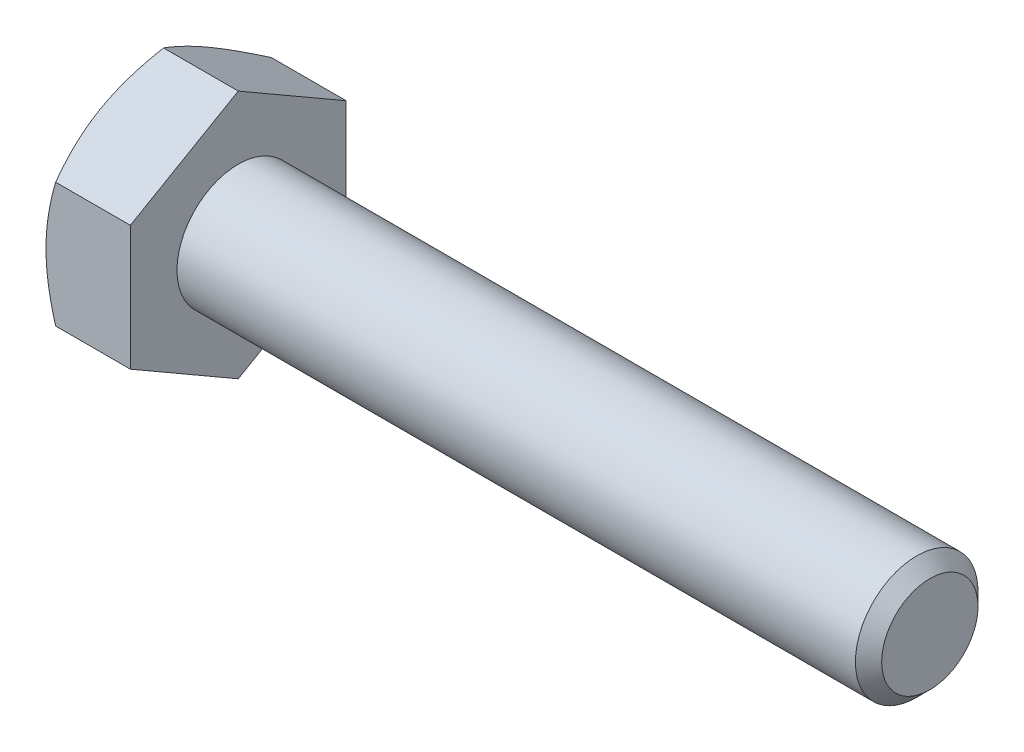
ISO-10303-21;
HEADER;
FILE_DESCRIPTION(('STEP AP214'),'2;1');
FILE_NAME('part.step','',(''),(''),'','','');
FILE_SCHEMA(('AUTOMOTIVE_DESIGN { 1 0 10303 214 1 1 1 1 }'));
ENDSEC;
DATA;
#1=APPLICATION_CONTEXT('core data for automotive mechanical design processes');
#2=APPLICATION_PROTOCOL_DEFINITION('international standard','automotive_design',2000,#1);
#3=PRODUCT_CONTEXT('',#1,'mechanical');
#4=PRODUCT('Part','Part','',(#3));
#5=PRODUCT_RELATED_PRODUCT_CATEGORY('part','',(#4));
#6=PRODUCT_DEFINITION_FORMATION('','',#4);
#7=PRODUCT_DEFINITION_CONTEXT('part definition',#1,'design');
#8=PRODUCT_DEFINITION('design','',#6,#7);
#9=PRODUCT_DEFINITION_SHAPE('','',#8);
#10=(LENGTH_UNIT() NAMED_UNIT(*) SI_UNIT(.MILLI.,.METRE.));
#11=(NAMED_UNIT(*) PLANE_ANGLE_UNIT() SI_UNIT($,.RADIAN.));
#12=(NAMED_UNIT(*) SI_UNIT($,.STERADIAN.) SOLID_ANGLE_UNIT());
#13=UNCERTAINTY_MEASURE_WITH_UNIT(LENGTH_MEASURE(1.E-05),#10,'distance_accuracy_value','');
#14=(GEOMETRIC_REPRESENTATION_CONTEXT(3) GLOBAL_UNCERTAINTY_ASSIGNED_CONTEXT((#13)) GLOBAL_UNIT_ASSIGNED_CONTEXT((#10,
#11,#12)) REPRESENTATION_CONTEXT('',''));
#15=CARTESIAN_POINT('',(0.,0.,0.));
#16=DIRECTION('',(0.,0.,1.));
#17=DIRECTION('',(1.,0.,0.));
#18=AXIS2_PLACEMENT_3D('',#15,#16,#17);
#19=CARTESIAN_POINT('',(-20.0914,-3.22623330423163,5.588));
#20=DIRECTION('',(0.,0.,-1.));
#21=DIRECTION('',(0.,1.,0.));
#22=AXIS2_PLACEMENT_3D('',#19,#20,#21);
#23=PLANE('',#22);
#24=CARTESIAN_POINT('',(-17.3028640773622,-8.79241733299138,5.588));
#25=CARTESIAN_POINT('',(-17.4223027517268,-8.54723365052731,5.588));
#26=CARTESIAN_POINT('',(-17.540632071546,-8.30150045908436,5.588));
#27=CARTESIAN_POINT('',(-17.7744504084549,-7.80864324642656,5.588));
#28=CARTESIAN_POINT('',(-17.8899390012354,-7.56151902413148,5.588));
#29=CARTESIAN_POINT('',(-18.1180083973891,-7.06437461564776,5.588));
#30=CARTESIAN_POINT('',(-18.2305710113902,-6.81434605700835,5.588));
#31=CARTESIAN_POINT('',(-18.4512546696523,-6.31234365850648,5.588));
#32=CARTESIAN_POINT('',(-18.559375915766,-6.06036990766935,5.588));
#33=CARTESIAN_POINT('',(-18.7735614835654,-5.54553577271013,5.588));
#34=CARTESIAN_POINT('',(-18.8794333505784,-5.28259489785967,5.588));
#35=CARTESIAN_POINT('',(-19.0834658980017,-4.75368383874693,5.588));
#36=CARTESIAN_POINT('',(-19.1816257311894,-4.48771332532167,5.588));
#37=CARTESIAN_POINT('',(-19.3677502162977,-3.95277881020881,5.588));
#38=CARTESIAN_POINT('',(-19.4557344448793,-3.68382168566319,5.588));
#39=CARTESIAN_POINT('',(-19.6187676515751,-3.14204851873727,5.588));
#40=CARTESIAN_POINT('',(-19.6938205712384,-2.86923367974657,5.588));
#41=CARTESIAN_POINT('',(-19.8270791448608,-2.32111075665161,5.588));
#42=CARTESIAN_POINT('',(-19.8853787694386,-2.04582588100145,5.588));
#43=CARTESIAN_POINT('',(-19.9819038776532,-1.49166543165662,5.588));
#44=CARTESIAN_POINT('',(-20.0201315338799,-1.2127902499258,5.588));
#45=CARTESIAN_POINT('',(-20.059887509277,-0.794749593743675,5.588));
#46=CARTESIAN_POINT('',(-20.070196723395,-0.656386242395602,5.588));
#47=CARTESIAN_POINT('',(-20.0849533838794,-0.379351954497299,5.588));
#48=CARTESIAN_POINT('',(-20.0894013863473,-0.240681048378031,5.588));
#49=CARTESIAN_POINT('',(-20.0923243387083,0.0367354614835919,5.588));
#50=CARTESIAN_POINT('',(-20.0907987686154,0.175481070677552,5.588));
#51=CARTESIAN_POINT('',(-20.0818142124428,0.452770250709483,5.588));
#52=CARTESIAN_POINT('',(-20.0743554566801,0.591313829180836,5.588));
#53=CARTESIAN_POINT('',(-20.049746692548,0.92047335139034,5.588));
#54=CARTESIAN_POINT('',(-20.0299931711523,1.11089906596391,5.588));
#55=CARTESIAN_POINT('',(-19.9803259496801,1.49041053761113,5.588));
#56=CARTESIAN_POINT('',(-19.950410976359,1.67949612373222,5.588));
#57=CARTESIAN_POINT('',(-19.847004133902,2.24447983670289,5.588));
#58=CARTESIAN_POINT('',(-19.7598662695881,2.61791755072369,5.588));
#59=CARTESIAN_POINT('',(-19.6077971455788,3.17659843479228,5.588));
#60=CARTESIAN_POINT('',(-19.5527937660189,3.3647111535347,5.588));
#61=CARTESIAN_POINT('',(-19.4368363155012,3.73911159951554,5.588));
#62=CARTESIAN_POINT('',(-19.3758821988698,3.9253993127345,5.588));
#63=CARTESIAN_POINT('',(-19.2490209507594,4.29620589688912,5.588));
#64=CARTESIAN_POINT('',(-19.183115224665,4.48072525308721,5.588));
#65=CARTESIAN_POINT('',(-19.047149963917,4.84821737770663,5.588));
#66=CARTESIAN_POINT('',(-18.9770905231941,5.0311901809943,5.588));
#67=CARTESIAN_POINT('',(-18.7836820551199,5.52227507989064,5.588));
#68=CARTESIAN_POINT('',(-18.6570924742431,5.82910969258589,5.588));
#69=CARTESIAN_POINT('',(-18.3965084900243,6.43962999563514,5.588));
#70=CARTESIAN_POINT('',(-18.262513274628,6.74331533630681,5.588));
#71=CARTESIAN_POINT('',(-17.9888653568763,7.34825705807035,5.588));
#72=CARTESIAN_POINT('',(-17.8492105200308,7.6495124703932,5.588));
#73=CARTESIAN_POINT('',(-17.5655924714153,8.24996661998419,5.588));
#74=CARTESIAN_POINT('',(-17.4216294330527,8.54916543943684,5.588));
#75=CARTESIAN_POINT('',(-17.1300992780332,9.14639017233497,5.588));
#76=CARTESIAN_POINT('',(-16.9825267751624,9.44441345115046,5.588));
#77=CARTESIAN_POINT('',(-16.6846919690219,10.0391134428576,5.588));
#78=CARTESIAN_POINT('',(-16.5344296436342,10.3357901446515,5.588));
#79=CARTESIAN_POINT('',(-16.0804944481936,11.2240448705627,5.588));
#80=CARTESIAN_POINT('',(-15.7736080938588,11.8139799206837,5.58799999999999));
#81=CARTESIAN_POINT('',(-15.1867455322786,12.9288265248744,5.58799999999999));
#82=CARTESIAN_POINT('',(-14.9073406904754,13.4540403139454,5.58799999999999));
#83=CARTESIAN_POINT('',(-14.3451547093138,14.5026982062163,5.58799999999999));
#84=CARTESIAN_POINT('',(-14.0623733643985,15.0261421991586,5.58799999999999));
#85=CARTESIAN_POINT('',(-13.4952594230397,16.0699244405322,5.58799999999999));
#86=CARTESIAN_POINT('',(-13.2109351588317,16.5902672232201,5.58799999999999));
#87=CARTESIAN_POINT('',(-12.6403692893914,17.6298478168022,5.58799999999999));
#88=CARTESIAN_POINT('',(-12.3541278364012,18.1490857112192,5.58799999999999));
#89=CARTESIAN_POINT('',(-12.0671882175838,18.6679350744275,5.58799999999999));
#90=B_SPLINE_CURVE_WITH_KNOTS('',3,(#24,#25,#26,#27,#28,#29,#30,#31,#32,#33,#34,#35,#36,#37,#38,
#39,#40,#41,#42,#43,#44,#45,#46,#47,#48,#49,#50,#51,#52,#53,#54,#55,#56,#57,#58,#59,#60,#61,#62,
#63,#64,#65,#66,#67,#68,#69,#70,#71,#72,#73,#74,#75,#76,#77,#78,#79,#80,#81,#82,#83,#84,#85,#86,
#87,#88,#89),.UNSPECIFIED.,.F.,.F.,(4,2,2,2,2,2,2,2,2,2,2,2,2,2,2,2,2,2,2,2,2,2,2,2,2,2,2,2,2,2,
2,2,4),(0.,0.81819381319176,1.63650910394173,2.4590688867784,3.28159124422942,4.13186288142681,
4.98222779685349,5.8309284936448,6.67937004139623,7.52295532640729,8.36644928291514,
8.78258467463132,9.19868058129904,9.61481270897336,10.0309286838311,10.6049497817259,
11.179042831839,12.327790508364,12.9157054618802,13.5036249281509,14.0913781547025,
14.6791180950858,15.6747398029821,16.6704709017855,17.6665810942242,18.6626512464556,
19.6603113831423,20.6579797271896,22.6528736136942,24.4375877996841,26.2224111963068,
28.001275119648,29.7799994214468),.UNSPECIFIED.);
#91=CARTESIAN_POINT('',(-19.5922999708983,-3.22623330423163,5.588));
#92=VERTEX_POINT('',#91);
#93=CARTESIAN_POINT('',(-20.0914,0.,5.588));
#94=VERTEX_POINT('',#93);
#95=EDGE_CURVE('E261',#92,#94,#90,.T.);
#96=ORIENTED_EDGE('',*,*,#95,.F.);
#97=DIRECTION('',(1.,0.,0.));
#98=VECTOR('',#97,1.);
#99=CARTESIAN_POINT('',(-20.0914,-3.22623330423163,5.588));
#100=LINE('',#99,#98);
#101=CARTESIAN_POINT('',(-15.7226,-3.22623330423163,5.588));
#102=VERTEX_POINT('',#101);
#103=EDGE_CURVE('E264',#92,#102,#100,.T.);
#104=ORIENTED_EDGE('',*,*,#103,.T.);
#105=DIRECTION('',(0.,1.,0.));
#106=VECTOR('',#105,1.);
#107=CARTESIAN_POINT('',(-15.7226,-3.22623330423163,5.588));
#108=LINE('',#107,#106);
#109=CARTESIAN_POINT('',(-15.7226,3.22623330423163,5.588));
#110=VERTEX_POINT('',#109);
#111=EDGE_CURVE('E266',#102,#110,#108,.T.);
#112=ORIENTED_EDGE('',*,*,#111,.T.);
#113=DIRECTION('',(1.,0.,0.));
#114=VECTOR('',#113,1.);
#115=CARTESIAN_POINT('',(-20.0914,3.22623330423163,5.588));
#116=LINE('',#115,#114);
#117=CARTESIAN_POINT('',(-19.5922999708983,3.22623330423163,5.588));
#118=VERTEX_POINT('',#117);
#119=EDGE_CURVE('E234',#118,#110,#116,.T.);
#120=ORIENTED_EDGE('',*,*,#119,.F.);
#121=EDGE_CURVE('E118',#94,#118,#90,.T.);
#122=ORIENTED_EDGE('',*,*,#121,.F.);
#123=EDGE_LOOP('',(#96,#104,#112,#120,#122));
#124=FACE_BOUND('',#123,.T.);
#125=ADVANCED_FACE('F42',(#124),#23,.F.);
#126=CARTESIAN_POINT('',(-20.0914,3.22623330423163,5.588));
#127=DIRECTION('',(0.,-0.866025403784439,-0.5));
#128=DIRECTION('',(0.,0.5,-0.866025403784439));
#129=AXIS2_PLACEMENT_3D('',#126,#127,#128);
#130=PLANE('',#129);
#131=CARTESIAN_POINT('',(-19.5922333024421,3.22611783417779,5.5882));
#132=CARTESIAN_POINT('',(-19.6331712302094,3.29703428087773,5.46536911122347));
#133=CARTESIAN_POINT('',(-19.6722512809091,3.36821513862342,5.34208024908159));
#134=CARTESIAN_POINT('',(-19.7461839258956,3.51115492143839,5.0945012828232));
#135=CARTESIAN_POINT('',(-19.7810346965124,3.58291408175004,4.97021077125495));
#136=CARTESIAN_POINT('',(-19.8785590369102,3.79934053377864,4.59534916023953));
#137=CARTESIAN_POINT('',(-19.9340300083912,3.94486214030133,4.34329834414319));
#138=CARTESIAN_POINT('',(-19.9990766884803,4.1626325806799,3.96610887702086));
#139=CARTESIAN_POINT('',(-20.0176066897358,4.2342307260177,3.8420972515681));
#140=CARTESIAN_POINT('',(-20.0486790066241,4.37775054122726,3.59351363973223));
#141=CARTESIAN_POINT('',(-20.061221851303,4.44967218194672,3.46894170384242));
#142=CARTESIAN_POINT('',(-20.0800001966958,4.59364038520367,3.21958146112699));
#143=CARTESIAN_POINT('',(-20.0862428557043,4.6656867125864,3.09479356160135));
#144=CARTESIAN_POINT('',(-20.0922936664508,4.80984195419064,2.84510935896543));
#145=CARTESIAN_POINT('',(-20.0921020169506,4.88195086641004,2.72021305932292));
#146=CARTESIAN_POINT('',(-20.0827324639545,5.07950845790681,2.37803327342957));
#147=CARTESIAN_POINT('',(-20.0670016610822,5.20489247600728,2.16086178362241));
#148=CARTESIAN_POINT('',(-20.0171180029902,5.45482771715137,1.72796124735887));
#149=CARTESIAN_POINT('',(-19.9829480959494,5.57937806113722,1.51223372347521));
#150=CARTESIAN_POINT('',(-19.8975327931439,5.82981634400382,1.07846189338994));
#151=CARTESIAN_POINT('',(-19.8459254824815,5.95567268044839,0.860472324213459));
#152=CARTESIAN_POINT('',(-19.7287975361716,6.20550842261546,0.427744125233422));
#153=CARTESIAN_POINT('',(-19.6633044154324,6.32949102819244,0.21299995311933));
#154=CARTESIAN_POINT('',(-19.5922333024421,6.4525820785171,-0.000200000000000311));
#155=B_SPLINE_CURVE_WITH_KNOTS('',3,(#131,#132,#133,#134,#135,#136,#137,#138,#139,#140,#141,
#142,#143,#144,#145,#146,#147,#148,#149,#150,#151,#152,#153,#154),.UNSPECIFIED.,.F.,.F.,(4,2,2,
2,2,2,2,2,2,2,2,4),(0.,0.442832959739192,0.885856196073715,1.77374363000408,2.20681321259303,
2.63984452054292,3.07238326088174,3.50490863971089,4.25790134074134,5.01159157867974,
5.78199820717711,6.55089229882471),.UNSPECIFIED.);
#156=CARTESIAN_POINT('',(-20.0914,4.83934995634744,2.794));
#157=VERTEX_POINT('',#156);
#158=EDGE_CURVE('E114',#118,#157,#155,.T.);
#159=ORIENTED_EDGE('',*,*,#158,.F.);
#160=ORIENTED_EDGE('',*,*,#119,.T.);
#161=DIRECTION('',(0.,0.5,-0.866025403784439));
#162=VECTOR('',#161,1.);
#163=CARTESIAN_POINT('',(-15.7226,3.22623330423163,5.588));
#164=LINE('',#163,#162);
#165=CARTESIAN_POINT('',(-15.7226,6.45246660846326,0.));
#166=VERTEX_POINT('',#165);
#167=EDGE_CURVE('E284',#110,#166,#164,.T.);
#168=ORIENTED_EDGE('',*,*,#167,.T.);
#169=DIRECTION('',(1.,0.,0.));
#170=VECTOR('',#169,1.);
#171=CARTESIAN_POINT('',(-20.0914,6.45246660846326,0.));
#172=LINE('',#171,#170);
#173=CARTESIAN_POINT('',(-19.5922999708983,6.45246660846326,0.));
#174=VERTEX_POINT('',#173);
#175=EDGE_CURVE('E137',#174,#166,#172,.T.);
#176=ORIENTED_EDGE('',*,*,#175,.F.);
#177=EDGE_CURVE('E122',#157,#174,#155,.T.);
#178=ORIENTED_EDGE('',*,*,#177,.F.);
#179=EDGE_LOOP('',(#159,#160,#168,#176,#178));
#180=FACE_BOUND('',#179,.T.);
#181=ADVANCED_FACE('F135',(#180),#130,.F.);
#182=CARTESIAN_POINT('',(-20.0914,6.45246660846326,0.));
#183=DIRECTION('',(0.,-0.866025403784439,0.5));
#184=DIRECTION('',(0.,-0.5,-0.866025403784439));
#185=AXIS2_PLACEMENT_3D('',#182,#183,#184);
#186=PLANE('',#185);
#187=CARTESIAN_POINT('',(-19.5922333024421,6.4525820785171,0.000199999999999124));
#188=CARTESIAN_POINT('',(-19.6331712302094,6.38166563181716,-0.122630888776533));
#189=CARTESIAN_POINT('',(-19.6722512809091,6.31048477407147,-0.245919750918404));
#190=CARTESIAN_POINT('',(-19.7461839258956,6.1675449912565,-0.493498717176801));
#191=CARTESIAN_POINT('',(-19.7810346965124,6.09578583094485,-0.617789228745045));
#192=CARTESIAN_POINT('',(-19.8785590369102,5.87935937891625,-0.992650839760465));
#193=CARTESIAN_POINT('',(-19.9340300083912,5.73383777239356,-1.24470165585681));
#194=CARTESIAN_POINT('',(-19.9990766884803,5.51606733201499,-1.62189112297913));
#195=CARTESIAN_POINT('',(-20.0176066897358,5.44446918667719,-1.7459027484319));
#196=CARTESIAN_POINT('',(-20.0486790066241,5.30094937146763,-1.99448636026776));
#197=CARTESIAN_POINT('',(-20.061221851303,5.22902773074817,-2.11905829615757));
#198=CARTESIAN_POINT('',(-20.0800001966958,5.08505952749122,-2.36841853887301));
#199=CARTESIAN_POINT('',(-20.0862428557043,5.01301320010849,-2.49320643839865));
#200=CARTESIAN_POINT('',(-20.0922936664508,4.86885795850425,-2.74289064103456));
#201=CARTESIAN_POINT('',(-20.0921020169506,4.79674904628485,-2.86778694067708));
#202=CARTESIAN_POINT('',(-20.0827324639545,4.59919145478808,-3.20996672657043));
#203=CARTESIAN_POINT('',(-20.0670016610822,4.47380743668761,-3.42713821637758));
#204=CARTESIAN_POINT('',(-20.0171180029902,4.22387219554352,-3.86003875264113));
#205=CARTESIAN_POINT('',(-19.9829480959494,4.09932185155768,-4.07576627652479));
#206=CARTESIAN_POINT('',(-19.8975327931439,3.84888356869107,-4.50953810661006));
#207=CARTESIAN_POINT('',(-19.8459254824815,3.7230272322465,-4.72752767578654));
#208=CARTESIAN_POINT('',(-19.7287975361716,3.47319149007943,-5.16025587476658));
#209=CARTESIAN_POINT('',(-19.6633044154324,3.34920888450245,-5.37500004688067));
#210=CARTESIAN_POINT('',(-19.5922333024421,3.22611783417779,-5.5882));
#211=B_SPLINE_CURVE_WITH_KNOTS('',3,(#187,#188,#189,#190,#191,#192,#193,#194,#195,#196,#197,
#198,#199,#200,#201,#202,#203,#204,#205,#206,#207,#208,#209,#210),.UNSPECIFIED.,.F.,.F.,(4,2,2,
2,2,2,2,2,2,2,2,4),(0.,0.442832959739192,0.885856196073713,1.77374363000408,2.20681321259302,
2.63984452054292,3.07238326088174,3.50490863971089,4.25790134074134,5.01159157867975,
5.78199820717711,6.55089229882472),.UNSPECIFIED.);
#212=CARTESIAN_POINT('',(-20.0914,4.83934995634744,-2.794));
#213=VERTEX_POINT('',#212);
#214=EDGE_CURVE('E127',#174,#213,#211,.T.);
#215=ORIENTED_EDGE('',*,*,#214,.F.);
#216=ORIENTED_EDGE('',*,*,#175,.T.);
#217=DIRECTION('',(0.,-0.5,-0.866025403784439));
#218=VECTOR('',#217,1.);
#219=CARTESIAN_POINT('',(-15.7226,6.45246660846326,0.));
#220=LINE('',#219,#218);
#221=CARTESIAN_POINT('',(-15.7226,3.22623330423163,-5.588));
#222=VERTEX_POINT('',#221);
#223=EDGE_CURVE('E281',#166,#222,#220,.T.);
#224=ORIENTED_EDGE('',*,*,#223,.T.);
#225=DIRECTION('',(1.,0.,0.));
#226=VECTOR('',#225,1.);
#227=CARTESIAN_POINT('',(-20.0914,3.22623330423163,-5.588));
#228=LINE('',#227,#226);
#229=CARTESIAN_POINT('',(-19.5922999708983,3.22623330423163,-5.588));
#230=VERTEX_POINT('',#229);
#231=EDGE_CURVE('E278',#230,#222,#228,.T.);
#232=ORIENTED_EDGE('',*,*,#231,.F.);
#233=EDGE_CURVE('E138',#213,#230,#211,.T.);
#234=ORIENTED_EDGE('',*,*,#233,.F.);
#235=EDGE_LOOP('',(#215,#216,#224,#232,#234));
#236=FACE_BOUND('',#235,.T.);
#237=ADVANCED_FACE('F198',(#236),#186,.F.);
#238=CARTESIAN_POINT('',(-20.0914,3.22623330423163,-5.588));
#239=DIRECTION('',(0.,0.,1.));
#240=DIRECTION('',(0.,-1.,0.));
#241=AXIS2_PLACEMENT_3D('',#238,#239,#240);
#242=PLANE('',#241);
#243=CARTESIAN_POINT('',(-17.3028640796963,-8.79241732820122,-5.588));
#244=CARTESIAN_POINT('',(-17.4223027539636,-8.54723364589842,-5.588));
#245=CARTESIAN_POINT('',(-17.5406320736856,-8.30150045461686,-5.588));
#246=CARTESIAN_POINT('',(-17.7744504104005,-7.80864324228234,-5.588));
#247=CARTESIAN_POINT('',(-17.8899390030842,-7.56151902014914,-5.588));
#248=CARTESIAN_POINT('',(-18.1180083990444,-7.06437461199162,-5.588));
#249=CARTESIAN_POINT('',(-18.2305710129487,-6.81434605351653,-5.588));
#250=CARTESIAN_POINT('',(-18.4512546710189,-6.31234365534442,-5.588));
#251=CARTESIAN_POINT('',(-18.5593759170373,-6.06036990467272,-5.588));
#252=CARTESIAN_POINT('',(-18.7735614846435,-5.54553577005742,-5.588));
#253=CARTESIAN_POINT('',(-18.8794333515586,-5.28259489538557,-5.588));
#254=CARTESIAN_POINT('',(-19.0834658987914,-4.7536838366329,-5.588));
#255=CARTESIAN_POINT('',(-19.1816257318864,-4.4877133233891,-5.588));
#256=CARTESIAN_POINT('',(-19.3677502168181,-3.95277880864251,-5.588));
#257=CARTESIAN_POINT('',(-19.4557344453158,-3.68382168428168,-5.588));
#258=CARTESIAN_POINT('',(-19.6187676518573,-3.14204851773037,-5.588));
#259=CARTESIAN_POINT('',(-19.6938205714503,-2.86923367892948,-5.588));
#260=CARTESIAN_POINT('',(-19.8270791449305,-2.3211107563107,-5.588));
#261=CARTESIAN_POINT('',(-19.8853787694419,-2.04582588094822,-5.588));
#262=CARTESIAN_POINT('',(-19.981903877567,-1.49166543218591,-5.588));
#263=CARTESIAN_POINT('',(-20.0201315337705,-1.21279025074993,-5.588));
#264=CARTESIAN_POINT('',(-20.0598875091721,-0.794749595008061,-5.588));
#265=CARTESIAN_POINT('',(-20.070196723298,-0.656386243804604,-5.588));
#266=CARTESIAN_POINT('',(-20.0849533838109,-0.379351956195272,-5.588));
#267=CARTESIAN_POINT('',(-20.0894013862995,-0.24068105022036,-5.588));
#268=CARTESIAN_POINT('',(-20.0923243387143,0.0367354593535725,-5.588));
#269=CARTESIAN_POINT('',(-20.0907987686546,0.175481068404198,-5.588));
#270=CARTESIAN_POINT('',(-20.0818142125601,0.452770248151342,-5.588));
#271=CARTESIAN_POINT('',(-20.0743554568424,0.591313826481243,-5.588));
#272=CARTESIAN_POINT('',(-20.0497466928206,0.920473348473753,-5.588));
#273=CARTESIAN_POINT('',(-20.0299931714883,1.1108990629724,-5.588));
#274=CARTESIAN_POINT('',(-19.9803259501463,1.49041053447319,-5.588));
#275=CARTESIAN_POINT('',(-19.950410976892,1.67949612052278,-5.588));
#276=CARTESIAN_POINT('',(-19.8470041346367,2.24447983328292,-5.588));
#277=CARTESIAN_POINT('',(-19.7598662704591,2.61791754716897,-5.588));
#278=CARTESIAN_POINT('',(-19.6077971466507,3.17659843103603,-5.588));
#279=CARTESIAN_POINT('',(-19.5527937671583,3.3647111497098,-5.588));
#280=CARTESIAN_POINT('',(-19.4368363167733,3.73911159555414,-5.588));
#281=CARTESIAN_POINT('',(-19.3758822002073,3.92539930870524,-5.588));
#282=CARTESIAN_POINT('',(-19.2490209522252,4.29620589272466,-5.588));
#283=CARTESIAN_POINT('',(-19.1831152261937,4.48072524885542,-5.588));
#284=CARTESIAN_POINT('',(-19.0471499655694,4.84821737334015,-5.588));
#285=CARTESIAN_POINT('',(-18.9770905249072,5.03119017656047,-5.588));
#286=CARTESIAN_POINT('',(-18.7836820569373,5.52227507541866,-5.588));
#287=CARTESIAN_POINT('',(-18.6570924760977,5.82910968814113,-5.588));
#288=CARTESIAN_POINT('',(-18.3965084919422,6.4396299912413,-5.588));
#289=CARTESIAN_POINT('',(-18.2625132765723,6.74331533193668,-5.588));
#290=CARTESIAN_POINT('',(-17.9888653588654,7.34825705374511,-5.588));
#291=CARTESIAN_POINT('',(-17.8492105220385,7.64951246608914,-5.588));
#292=CARTESIAN_POINT('',(-17.5655924734546,8.2499666157202,-5.588));
#293=CARTESIAN_POINT('',(-17.4216294351051,8.54916543519174,-5.588));
#294=CARTESIAN_POINT('',(-17.1300992801071,9.14639016812708,-5.588));
#295=CARTESIAN_POINT('',(-16.9825267772448,9.44441344696089,-5.588));
#296=CARTESIAN_POINT('',(-16.6846919711181,10.0391134387033,-5.588));
#297=CARTESIAN_POINT('',(-16.5344296457359,10.3357901405142,-5.588));
#298=CARTESIAN_POINT('',(-16.0804944503084,11.2240448664743,-5.588));
#299=CARTESIAN_POINT('',(-15.773608095978,11.8139799166255,-5.588));
#300=CARTESIAN_POINT('',(-15.1867455344141,12.9288265208464,-5.588));
#301=CARTESIAN_POINT('',(-14.9073406926236,13.4540403099175,-5.588));
#302=CARTESIAN_POINT('',(-14.3451547114848,14.5026982021875,-5.588));
#303=CARTESIAN_POINT('',(-14.0623733665796,15.0261421951287,-5.588));
#304=CARTESIAN_POINT('',(-13.4952594252416,16.0699244364951,-5.588));
#305=CARTESIAN_POINT('',(-13.2109351610443,16.5902672191768,-5.588));
#306=CARTESIAN_POINT('',(-12.6403692916242,17.6298478127458,-5.588));
#307=CARTESIAN_POINT('',(-12.3541278386435,18.1490857071558,-5.588));
#308=CARTESIAN_POINT('',(-12.0671882198352,18.6679350703569,-5.58800000000001));
#309=B_SPLINE_CURVE_WITH_KNOTS('',3,(#243,#244,#245,#246,#247,#248,#249,#250,#251,#252,#253,
#254,#255,#256,#257,#258,#259,#260,#261,#262,#263,#264,#265,#266,#267,#268,#269,#270,#271,#272,
#273,#274,#275,#276,#277,#278,#279,#280,#281,#282,#283,#284,#285,#286,#287,#288,#289,#290,#291,
#292,#293,#294,#295,#296,#297,#298,#299,#300,#301,#302,#303,#304,#305,#306,#307,#308),
.UNSPECIFIED.,.F.,.F.,(4,2,2,2,2,2,2,2,2,2,2,2,2,2,2,2,2,2,2,2,2,2,2,2,2,2,2,2,2,2,2,2,4),(0.,
0.818193812628983,1.63650910281609,2.45906888508403,3.28159124196637,4.13186287855712,
4.98222779337696,5.83092848956339,6.67937003671041,7.52295532083765,8.36644927646298,
8.78258466774862,9.19868057398591,9.61481270122955,10.0309286756566,10.6049497733084,
11.1790428231783,12.3277904992162,12.9157054524777,13.5036249184939,14.0913781447917,
14.6791180849211,15.6747397928501,16.6704708916865,17.6665810841593,18.6626512364247,
19.6603113731493,20.6579797172346,22.6528736038138,24.4375877897862,26.2224111863916,
28.0012751097012,29.779999411468),.UNSPECIFIED.);
#310=CARTESIAN_POINT('',(-20.0914,0.,-5.588));
#311=VERTEX_POINT('',#310);
#312=EDGE_CURVE('E192',#230,#311,#309,.F.);
#313=ORIENTED_EDGE('',*,*,#312,.F.);
#314=ORIENTED_EDGE('',*,*,#231,.T.);
#315=DIRECTION('',(0.,-1.,0.));
#316=VECTOR('',#315,1.);
#317=CARTESIAN_POINT('',(-15.7226,3.22623330423163,-5.588));
#318=LINE('',#317,#316);
#319=CARTESIAN_POINT('',(-15.7226,-3.22623330423163,-5.588));
#320=VERTEX_POINT('',#319);
#321=EDGE_CURVE('E288',#222,#320,#318,.T.);
#322=ORIENTED_EDGE('',*,*,#321,.T.);
#323=DIRECTION('',(1.,0.,0.));
#324=VECTOR('',#323,1.);
#325=CARTESIAN_POINT('',(-20.0914,-3.22623330423163,-5.588));
#326=LINE('',#325,#324);
#327=CARTESIAN_POINT('',(-19.5922999708983,-3.22623330423163,-5.588));
#328=VERTEX_POINT('',#327);
#329=EDGE_CURVE('E249',#328,#320,#326,.T.);
#330=ORIENTED_EDGE('',*,*,#329,.F.);
#331=EDGE_CURVE('E186',#311,#328,#309,.F.);
#332=ORIENTED_EDGE('',*,*,#331,.F.);
#333=EDGE_LOOP('',(#313,#314,#322,#330,#332));
#334=FACE_BOUND('',#333,.T.);
#335=ADVANCED_FACE('F194',(#334),#242,.F.);
#336=CARTESIAN_POINT('',(-20.0914,-3.22623330423163,-5.588));
#337=DIRECTION('',(0.,0.866025403784439,0.5));
#338=DIRECTION('',(0.,-0.5,0.866025403784439));
#339=AXIS2_PLACEMENT_3D('',#336,#337,#338);
#340=PLANE('',#339);
#341=CARTESIAN_POINT('',(-19.5922333024421,-3.22611783417779,-5.5882));
#342=CARTESIAN_POINT('',(-19.6331712302094,-3.29703428087772,-5.46536911122347));
#343=CARTESIAN_POINT('',(-19.6722512809091,-3.36821513862341,-5.3420802490816));
#344=CARTESIAN_POINT('',(-19.7461839258956,-3.51115492143839,-5.0945012828232));
#345=CARTESIAN_POINT('',(-19.7810346965124,-3.58291408175003,-4.97021077125495));
#346=CARTESIAN_POINT('',(-19.8785590369102,-3.79934053377864,-4.59534916023953));
#347=CARTESIAN_POINT('',(-19.9340300083912,-3.94486214030133,-4.34329834414319));
#348=CARTESIAN_POINT('',(-19.9990766884803,-4.1626325806799,-3.96610887702087));
#349=CARTESIAN_POINT('',(-20.0176066897358,-4.23423072601769,-3.8420972515681));
#350=CARTESIAN_POINT('',(-20.0486790066241,-4.37775054122726,-3.59351363973223));
#351=CARTESIAN_POINT('',(-20.061221851303,-4.44967218194671,-3.46894170384243));
#352=CARTESIAN_POINT('',(-20.0800001966958,-4.59364038520366,-3.21958146112699));
#353=CARTESIAN_POINT('',(-20.0862428557043,-4.6656867125864,-3.09479356160135));
#354=CARTESIAN_POINT('',(-20.0922936664508,-4.80984195419064,-2.84510935896544));
#355=CARTESIAN_POINT('',(-20.0921020169506,-4.88195086641004,-2.72021305932292));
#356=CARTESIAN_POINT('',(-20.0827324639545,-5.07950845790681,-2.37803327342957));
#357=CARTESIAN_POINT('',(-20.0670016610822,-5.20489247600728,-2.16086178362242));
#358=CARTESIAN_POINT('',(-20.0171180029902,-5.45482771715137,-1.72796124735887));
#359=CARTESIAN_POINT('',(-19.9829480959494,-5.57937806113721,-1.51223372347521));
#360=CARTESIAN_POINT('',(-19.897532793144,-5.82981634400382,-1.07846189338994));
#361=CARTESIAN_POINT('',(-19.8459254824815,-5.95567268044839,-0.86047232421346));
#362=CARTESIAN_POINT('',(-19.7287975361716,-6.20550842261546,-0.427744125233424));
#363=CARTESIAN_POINT('',(-19.6633044154324,-6.32949102819243,-0.212999953119332));
#364=CARTESIAN_POINT('',(-19.5922333024421,-6.45258207851709,0.000199999999999051));
#365=B_SPLINE_CURVE_WITH_KNOTS('',3,(#341,#342,#343,#344,#345,#346,#347,#348,#349,#350,#351,
#352,#353,#354,#355,#356,#357,#358,#359,#360,#361,#362,#363,#364),.UNSPECIFIED.,.F.,.F.,(4,2,2,
2,2,2,2,2,2,2,2,4),(0.,0.442832959739191,0.885856196073715,1.77374363000408,2.20681321259303,
2.63984452054292,3.07238326088174,3.50490863971089,4.25790134074134,5.01159157867975,
5.78199820717712,6.55089229882472),.UNSPECIFIED.);
#366=CARTESIAN_POINT('',(-20.0914,-4.83934995634744,-2.794));
#367=VERTEX_POINT('',#366);
#368=EDGE_CURVE('E193',#328,#367,#365,.T.);
#369=ORIENTED_EDGE('',*,*,#368,.F.);
#370=ORIENTED_EDGE('',*,*,#329,.T.);
#371=DIRECTION('',(0.,-0.5,0.866025403784439));
#372=VECTOR('',#371,1.);
#373=CARTESIAN_POINT('',(-15.7226,-3.22623330423163,-5.588));
#374=LINE('',#373,#372);
#375=CARTESIAN_POINT('',(-15.7226,-6.45246660846326,0.));
#376=VERTEX_POINT('',#375);
#377=EDGE_CURVE('E273',#320,#376,#374,.T.);
#378=ORIENTED_EDGE('',*,*,#377,.T.);
#379=DIRECTION('',(1.,0.,0.));
#380=VECTOR('',#379,1.);
#381=CARTESIAN_POINT('',(-20.0914,-6.45246660846326,0.));
#382=LINE('',#381,#380);
#383=CARTESIAN_POINT('',(-19.5922999708983,-6.45246660846326,0.));
#384=VERTEX_POINT('',#383);
#385=EDGE_CURVE('E270',#384,#376,#382,.T.);
#386=ORIENTED_EDGE('',*,*,#385,.F.);
#387=EDGE_CURVE('E180',#367,#384,#365,.T.);
#388=ORIENTED_EDGE('',*,*,#387,.F.);
#389=EDGE_LOOP('',(#369,#370,#378,#386,#388));
#390=FACE_BOUND('',#389,.T.);
#391=ADVANCED_FACE('F197',(#390),#340,.F.);
#392=CARTESIAN_POINT('',(-20.0914,-6.45246660846326,0.));
#393=DIRECTION('',(0.,0.866025403784439,-0.5));
#394=DIRECTION('',(0.,0.5,0.866025403784439));
#395=AXIS2_PLACEMENT_3D('',#392,#393,#394);
#396=PLANE('',#395);
#397=CARTESIAN_POINT('',(-19.5922333024421,-6.4525820785171,-0.000200000000000763));
#398=CARTESIAN_POINT('',(-19.6331712302094,-6.38166563181716,0.122630888776531));
#399=CARTESIAN_POINT('',(-19.6722512809091,-6.31048477407147,0.245919750918403));
#400=CARTESIAN_POINT('',(-19.7461839258956,-6.1675449912565,0.4934987171768));
#401=CARTESIAN_POINT('',(-19.7810346965124,-6.09578583094485,0.617789228745044));
#402=CARTESIAN_POINT('',(-19.8785590369102,-5.87935937891625,0.992650839760464));
#403=CARTESIAN_POINT('',(-19.9340300083912,-5.73383777239356,1.24470165585681));
#404=CARTESIAN_POINT('',(-19.9990766884803,-5.51606733201499,1.62189112297913));
#405=CARTESIAN_POINT('',(-20.0176066897358,-5.44446918667719,1.7459027484319));
#406=CARTESIAN_POINT('',(-20.0486790066241,-5.30094937146763,1.99448636026776));
#407=CARTESIAN_POINT('',(-20.061221851303,-5.22902773074817,2.11905829615757));
#408=CARTESIAN_POINT('',(-20.0800001966958,-5.08505952749123,2.36841853887301));
#409=CARTESIAN_POINT('',(-20.0862428557043,-5.01301320010849,2.49320643839865));
#410=CARTESIAN_POINT('',(-20.0922936664508,-4.86885795850425,2.74289064103456));
#411=CARTESIAN_POINT('',(-20.0921020169506,-4.79674904628485,2.86778694067708));
#412=CARTESIAN_POINT('',(-20.0827324639545,-4.59919145478808,3.20996672657042));
#413=CARTESIAN_POINT('',(-20.0670016610822,-4.47380743668761,3.42713821637758));
#414=CARTESIAN_POINT('',(-20.0171180029902,-4.22387219554352,3.86003875264113));
#415=CARTESIAN_POINT('',(-19.9829480959494,-4.09932185155767,4.07576627652479));
#416=CARTESIAN_POINT('',(-19.897532793144,-3.84888356869106,4.50953810661006));
#417=CARTESIAN_POINT('',(-19.8459254824815,-3.72302723224649,4.72752767578654));
#418=CARTESIAN_POINT('',(-19.7287975361716,-3.47319149007943,5.16025587476658));
#419=CARTESIAN_POINT('',(-19.6633044154324,-3.34920888450245,5.37500004688067));
#420=CARTESIAN_POINT('',(-19.5922333024421,-3.22611783417779,5.5882));
#421=B_SPLINE_CURVE_WITH_KNOTS('',3,(#397,#398,#399,#400,#401,#402,#403,#404,#405,#406,#407,
#408,#409,#410,#411,#412,#413,#414,#415,#416,#417,#418,#419,#420),.UNSPECIFIED.,.F.,.F.,(4,2,2,
2,2,2,2,2,2,2,2,4),(0.,0.442832959739192,0.885856196073713,1.77374363000408,2.20681321259302,
2.63984452054292,3.07238326088174,3.50490863971089,4.25790134074134,5.01159157867975,
5.78199820717712,6.55089229882472),.UNSPECIFIED.);
#422=CARTESIAN_POINT('',(-20.0914,-4.83934995634744,2.794));
#423=VERTEX_POINT('',#422);
#424=EDGE_CURVE('E256',#384,#423,#421,.T.);
#425=ORIENTED_EDGE('',*,*,#424,.F.);
#426=ORIENTED_EDGE('',*,*,#385,.T.);
#427=DIRECTION('',(0.,0.5,0.866025403784439));
#428=VECTOR('',#427,1.);
#429=CARTESIAN_POINT('',(-15.7226,-6.45246660846326,0.));
#430=LINE('',#429,#428);
#431=EDGE_CURVE('E268',#376,#102,#430,.T.);
#432=ORIENTED_EDGE('',*,*,#431,.T.);
#433=ORIENTED_EDGE('',*,*,#103,.F.);
#434=EDGE_CURVE('E132',#423,#92,#421,.T.);
#435=ORIENTED_EDGE('',*,*,#434,.F.);
#436=EDGE_LOOP('',(#425,#426,#432,#433,#435));
#437=FACE_BOUND('',#436,.T.);
#438=ADVANCED_FACE('F219',(#437),#396,.F.);
#439=CARTESIAN_POINT('',(-15.7226,0.,0.));
#440=DIRECTION('',(1.,0.,0.));
#441=DIRECTION('',(0.,0.,-1.));
#442=AXIS2_PLACEMENT_3D('',#439,#440,#441);
#443=CYLINDRICAL_SURFACE('',#442,3.175);
#444=CARTESIAN_POINT('',(19.4110428571429,0.,0.));
#445=DIRECTION('',(1.,0.,0.));
#446=DIRECTION('',(0.,0.,-1.));
#447=AXIS2_PLACEMENT_3D('',#444,#445,#446);
#448=CIRCLE('',#447,3.175);
#449=CARTESIAN_POINT('',(19.4110428571429,0.,3.175));
#450=VERTEX_POINT('',#449);
#451=EDGE_CURVE('E228',#450,#450,#448,.F.);
#452=ORIENTED_EDGE('',*,*,#451,.T.);
#453=EDGE_LOOP('',(#452));
#454=FACE_BOUND('',#453,.T.);
#455=CARTESIAN_POINT('',(-15.7226,0.,0.));
#456=DIRECTION('',(-1.,0.,0.));
#457=DIRECTION('',(0.,0.,1.));
#458=AXIS2_PLACEMENT_3D('',#455,#456,#457);
#459=CIRCLE('',#458,3.175);
#460=CARTESIAN_POINT('',(-15.7226,0.,3.175));
#461=VERTEX_POINT('',#460);
#462=EDGE_CURVE('E231',#461,#461,#459,.F.);
#463=ORIENTED_EDGE('',*,*,#462,.T.);
#464=EDGE_LOOP('',(#463));
#465=FACE_BOUND('',#464,.T.);
#466=ADVANCED_FACE('F216',(#454,#465),#443,.T.);
#467=CARTESIAN_POINT('',(20.0914,0.,0.));
#468=DIRECTION('',(1.,0.,0.));
#469=DIRECTION('',(0.,0.,-1.));
#470=AXIS2_PLACEMENT_3D('',#467,#468,#469);
#471=PLANE('',#470);
#472=CARTESIAN_POINT('',(20.0914,0.,0.));
#473=DIRECTION('',(1.,0.,0.));
#474=DIRECTION('',(0.,0.,-1.));
#475=AXIS2_PLACEMENT_3D('',#472,#473,#474);
#476=CIRCLE('',#475,2.49464285714286);
#477=CARTESIAN_POINT('',(20.0914,0.,2.49464285714286));
#478=VERTEX_POINT('',#477);
#479=EDGE_CURVE('E233',#478,#478,#476,.T.);
#480=ORIENTED_EDGE('',*,*,#479,.T.);
#481=EDGE_LOOP('',(#480));
#482=FACE_BOUND('',#481,.T.);
#483=ADVANCED_FACE('F214',(#482),#471,.T.);
#484=CARTESIAN_POINT('',(20.0914,0.,0.));
#485=DIRECTION('',(-1.,0.,0.));
#486=DIRECTION('',(0.,0.,1.));
#487=AXIS2_PLACEMENT_3D('',#484,#485,#486);
#488=CONICAL_SURFACE('',#487,2.49464285714286,0.785398163397448);
#489=CARTESIAN_POINT('',(19.4110428571429,0.,3.175));
#490=CARTESIAN_POINT('',(19.4181299107143,0.,3.16791294642857));
#491=CARTESIAN_POINT('',(19.4252169642857,0.,3.16082589285714));
#492=CARTESIAN_POINT('',(19.4393910714286,0.,3.14665178571429));
#493=CARTESIAN_POINT('',(19.446478125,0.,3.13956473214286));
#494=CARTESIAN_POINT('',(19.4606522321429,0.,3.125390625));
#495=CARTESIAN_POINT('',(19.4677392857143,0.,3.11830357142857));
#496=CARTESIAN_POINT('',(19.4819133928571,0.,3.10412946428572));
#497=CARTESIAN_POINT('',(19.4890004464286,0.,3.09704241071429));
#498=CARTESIAN_POINT('',(19.5031745535714,0.,3.08286830357143));
#499=CARTESIAN_POINT('',(19.5102616071429,0.,3.07578125));
#500=CARTESIAN_POINT('',(19.5244357142857,0.,3.06160714285714));
#501=CARTESIAN_POINT('',(19.5315227678571,0.,3.05452008928572));
#502=CARTESIAN_POINT('',(19.545696875,0.,3.04034598214286));
#503=CARTESIAN_POINT('',(19.5527839285714,0.,3.03325892857143));
#504=CARTESIAN_POINT('',(19.5669580357143,0.,3.01908482142857));
#505=CARTESIAN_POINT('',(19.5740450892857,0.,3.01199776785714));
#506=CARTESIAN_POINT('',(19.5882191964286,0.,2.99782366071429));
#507=CARTESIAN_POINT('',(19.59530625,0.,2.99073660714286));
#508=CARTESIAN_POINT('',(19.6094803571429,0.,2.9765625));
#509=CARTESIAN_POINT('',(19.6165674107143,0.,2.96947544642857));
#510=CARTESIAN_POINT('',(19.6307415178571,0.,2.95530133928572));
#511=CARTESIAN_POINT('',(19.6378285714286,0.,2.94821428571429));
#512=CARTESIAN_POINT('',(19.6520026785714,0.,2.93404017857143));
#513=CARTESIAN_POINT('',(19.6590897321429,0.,2.926953125));
#514=CARTESIAN_POINT('',(19.6732638392857,0.,2.91277901785715));
#515=CARTESIAN_POINT('',(19.6803508928571,0.,2.90569196428572));
#516=CARTESIAN_POINT('',(19.694525,0.,2.89151785714286));
#517=CARTESIAN_POINT('',(19.7016120535714,0.,2.88443080357143));
#518=CARTESIAN_POINT('',(19.7157861607143,0.,2.87025669642857));
#519=CARTESIAN_POINT('',(19.7228732142857,0.,2.86316964285714));
#520=CARTESIAN_POINT('',(19.7370473214286,0.,2.84899553571429));
#521=CARTESIAN_POINT('',(19.744134375,0.,2.84190848214286));
#522=CARTESIAN_POINT('',(19.7583084821429,0.,2.827734375));
#523=CARTESIAN_POINT('',(19.7653955357143,0.,2.82064732142857));
#524=CARTESIAN_POINT('',(19.7795696428571,0.,2.80647321428572));
#525=CARTESIAN_POINT('',(19.7866566964286,0.,2.79938616071429));
#526=CARTESIAN_POINT('',(19.8008308035714,0.,2.78521205357143));
#527=CARTESIAN_POINT('',(19.8079178571429,0.,2.778125));
#528=CARTESIAN_POINT('',(19.8220919642857,0.,2.76395089285715));
#529=CARTESIAN_POINT('',(19.8291790178571,0.,2.75686383928572));
#530=CARTESIAN_POINT('',(19.843353125,0.,2.74268973214286));
#531=CARTESIAN_POINT('',(19.8504401785714,0.,2.73560267857143));
#532=CARTESIAN_POINT('',(19.8646142857143,0.,2.72142857142857));
#533=CARTESIAN_POINT('',(19.8717013392857,0.,2.71434151785715));
#534=CARTESIAN_POINT('',(19.8858754464286,0.,2.70016741071429));
#535=CARTESIAN_POINT('',(19.8929625,0.,2.69308035714286));
#536=CARTESIAN_POINT('',(19.9071366071429,0.,2.67890625));
#537=CARTESIAN_POINT('',(19.9142236607143,0.,2.67181919642857));
#538=CARTESIAN_POINT('',(19.9283977678571,0.,2.65764508928572));
#539=CARTESIAN_POINT('',(19.9354848214286,0.,2.65055803571429));
#540=CARTESIAN_POINT('',(19.9496589285714,0.,2.63638392857143));
#541=CARTESIAN_POINT('',(19.9567459821429,0.,2.629296875));
#542=CARTESIAN_POINT('',(19.9709200892857,0.,2.61512276785715));
#543=CARTESIAN_POINT('',(19.9780071428571,0.,2.60803571428572));
#544=CARTESIAN_POINT('',(19.99218125,0.,2.59386160714286));
#545=CARTESIAN_POINT('',(19.9992683035714,0.,2.58677455357143));
#546=CARTESIAN_POINT('',(20.0134424107143,0.,2.57260044642857));
#547=CARTESIAN_POINT('',(20.0205294642857,0.,2.56551339285715));
#548=CARTESIAN_POINT('',(20.0347035714286,0.,2.55133928571429));
#549=CARTESIAN_POINT('',(20.041790625,0.,2.54425223214286));
#550=CARTESIAN_POINT('',(20.0559647321429,0.,2.530078125));
#551=CARTESIAN_POINT('',(20.0630517857143,0.,2.52299107142857));
#552=CARTESIAN_POINT('',(20.0772258928571,0.,2.50881696428572));
#553=CARTESIAN_POINT('',(20.0843129464286,0.,2.50172991071429));
#554=CARTESIAN_POINT('',(20.0914,0.,2.49464285714286));
#555=B_SPLINE_CURVE_WITH_KNOTS('',3,(#489,#490,#491,#492,#493,#494,#495,#496,#497,#498,#499,
#500,#501,#502,#503,#504,#505,#506,#507,#508,#509,#510,#511,#512,#513,#514,#515,#516,#517,#518,
#519,#520,#521,#522,#523,#524,#525,#526,#527,#528,#529,#530,#531,#532,#533,#534,#535,#536,#537,
#538,#539,#540,#541,#542,#543,#544,#545,#546,#547,#548,#549,#550,#551,#552,#553,#554),
.UNSPECIFIED.,.F.,.F.,(4,2,2,2,2,2,2,2,2,2,2,2,2,2,2,2,2,2,2,2,2,2,2,2,2,2,2,2,2,2,2,2,4),(0.,
0.0300678218339356,0.0601356436678734,0.0902034655018091,0.120271287335747,0.150339109169682,
0.18040693100362,0.210474752837556,0.240542574671494,0.270610396505432,0.300678218339367,
0.330746040173305,0.36081386200724,0.390881683841178,0.420949505675114,0.451017327509052,
0.48108514934299,0.511152971176925,0.541220793010863,0.571288614844798,0.601356436678737,
0.631424258512672,0.66149208034661,0.691559902180545,0.721627724014483,0.751695545848421,
0.781763367682357,0.811831189516295,0.84189901135023,0.871966833184168,0.902034655018103,
0.932102476852042,0.962170298685979),.UNSPECIFIED.);
#556=EDGE_CURVE('BSEAM44',#450,#478,#555,.T.);
#557=ORIENTED_EDGE('',*,*,#451,.F.);
#558=ORIENTED_EDGE('',*,*,#479,.F.);
#559=ORIENTED_EDGE('',*,*,#556,.T.);
#560=ORIENTED_EDGE('',*,*,#556,.F.);
#561=EDGE_LOOP('',(#557,#559,#558,#560));
#562=FACE_BOUND('',#561,.T.);
#563=ADVANCED_FACE('F44',(#562),#488,.T.);
#564=CARTESIAN_POINT('',(-15.7226,3.22623330423163,5.588));
#565=DIRECTION('',(-1.,0.,0.));
#566=DIRECTION('',(0.,0.,1.));
#567=AXIS2_PLACEMENT_3D('',#564,#565,#566);
#568=PLANE('',#567);
#569=ORIENTED_EDGE('',*,*,#462,.F.);
#570=EDGE_LOOP('',(#569));
#571=FACE_BOUND('',#570,.T.);
#572=ORIENTED_EDGE('',*,*,#111,.F.);
#573=ORIENTED_EDGE('',*,*,#431,.F.);
#574=ORIENTED_EDGE('',*,*,#377,.F.);
#575=ORIENTED_EDGE('',*,*,#321,.F.);
#576=ORIENTED_EDGE('',*,*,#223,.F.);
#577=ORIENTED_EDGE('',*,*,#167,.F.);
#578=EDGE_LOOP('',(#572,#573,#574,#575,#576,#577));
#579=FACE_BOUND('',#578,.T.);
#580=ADVANCED_FACE('F165',(#571,#579),#568,.F.);
#581=CARTESIAN_POINT('',(-20.0914,0.,0.));
#582=DIRECTION('',(1.,0.,0.));
#583=DIRECTION('',(0.,0.,1.));
#584=AXIS2_PLACEMENT_3D('',#581,#582,#583);
#585=CONICAL_SURFACE('',#584,5.588,1.0471975511966);
#586=ORIENTED_EDGE('',*,*,#95,.T.);
#587=CARTESIAN_POINT('',(-20.0914,0.,0.));
#588=DIRECTION('',(-1.,0.,0.));
#589=DIRECTION('',(0.,0.,1.));
#590=AXIS2_PLACEMENT_3D('',#587,#588,#589);
#591=CIRCLE('',#590,5.588);
#592=EDGE_CURVE('E46',#423,#94,#591,.T.);
#593=ORIENTED_EDGE('',*,*,#592,.F.);
#594=ORIENTED_EDGE('',*,*,#434,.T.);
#595=EDGE_LOOP('',(#586,#593,#594));
#596=FACE_BOUND('',#595,.T.);
#597=ADVANCED_FACE('F160',(#596),#585,.T.);
#598=ORIENTED_EDGE('',*,*,#387,.T.);
#599=ORIENTED_EDGE('',*,*,#424,.T.);
#600=EDGE_CURVE('E66',#367,#423,#591,.T.);
#601=ORIENTED_EDGE('',*,*,#600,.F.);
#602=EDGE_LOOP('',(#598,#599,#601));
#603=FACE_BOUND('',#602,.T.);
#604=ADVANCED_FACE('F164',(#603),#585,.T.);
#605=ORIENTED_EDGE('',*,*,#331,.T.);
#606=ORIENTED_EDGE('',*,*,#368,.T.);
#607=EDGE_CURVE('E240',#311,#367,#591,.T.);
#608=ORIENTED_EDGE('',*,*,#607,.F.);
#609=EDGE_LOOP('',(#605,#606,#608));
#610=FACE_BOUND('',#609,.T.);
#611=ADVANCED_FACE('F252',(#610),#585,.T.);
#612=ORIENTED_EDGE('',*,*,#233,.T.);
#613=ORIENTED_EDGE('',*,*,#312,.T.);
#614=EDGE_CURVE('E51',#213,#311,#591,.T.);
#615=ORIENTED_EDGE('',*,*,#614,.F.);
#616=EDGE_LOOP('',(#612,#613,#615));
#617=FACE_BOUND('',#616,.T.);
#618=ADVANCED_FACE('F291',(#617),#585,.T.);
#619=ORIENTED_EDGE('',*,*,#177,.T.);
#620=ORIENTED_EDGE('',*,*,#214,.T.);
#621=EDGE_CURVE('E12',#157,#213,#591,.T.);
#622=ORIENTED_EDGE('',*,*,#621,.F.);
#623=EDGE_LOOP('',(#619,#620,#622));
#624=FACE_BOUND('',#623,.T.);
#625=ADVANCED_FACE('F125',(#624),#585,.T.);
#626=ORIENTED_EDGE('',*,*,#121,.T.);
#627=ORIENTED_EDGE('',*,*,#158,.T.);
#628=CARTESIAN_POINT('',(-20.0914,0.,0.));
#629=DIRECTION('',(-1.,0.,0.));
#630=DIRECTION('',(0.,0.,1.));
#631=AXIS2_PLACEMENT_3D('',#628,#629,#630);
#632=CIRCLE('',#631,5.588);
#633=EDGE_CURVE('E58',#94,#157,#632,.T.);
#634=ORIENTED_EDGE('',*,*,#633,.F.);
#635=EDGE_LOOP('',(#626,#627,#634));
#636=FACE_BOUND('',#635,.T.);
#637=ADVANCED_FACE('F116',(#636),#585,.T.);
#638=CARTESIAN_POINT('',(-20.0914,3.22623330423163,5.588));
#639=DIRECTION('',(-1.,0.,0.));
#640=DIRECTION('',(0.,0.,1.));
#641=AXIS2_PLACEMENT_3D('',#638,#639,#640);
#642=PLANE('',#641);
#643=ORIENTED_EDGE('',*,*,#592,.T.);
#644=ORIENTED_EDGE('',*,*,#633,.T.);
#645=ORIENTED_EDGE('',*,*,#621,.T.);
#646=ORIENTED_EDGE('',*,*,#614,.T.);
#647=ORIENTED_EDGE('',*,*,#607,.T.);
#648=ORIENTED_EDGE('',*,*,#600,.T.);
#649=EDGE_LOOP('',(#643,#644,#645,#646,#647,#648));
#650=FACE_BOUND('',#649,.T.);
#651=ADVANCED_FACE('F131',(#650),#642,.T.);
#652=CLOSED_SHELL('',(#125,#181,#237,#335,#391,#438,#466,#483,#563,#580,#597,#604,#611,#618,
#625,#637,#651));
#653=MANIFOLD_SOLID_BREP('B2',#652);
#654=ADVANCED_BREP_SHAPE_REPRESENTATION('',(#18,#653),#14);
#655=SHAPE_DEFINITION_REPRESENTATION(#9,#654);
ENDSEC;
END-ISO-10303-21;
